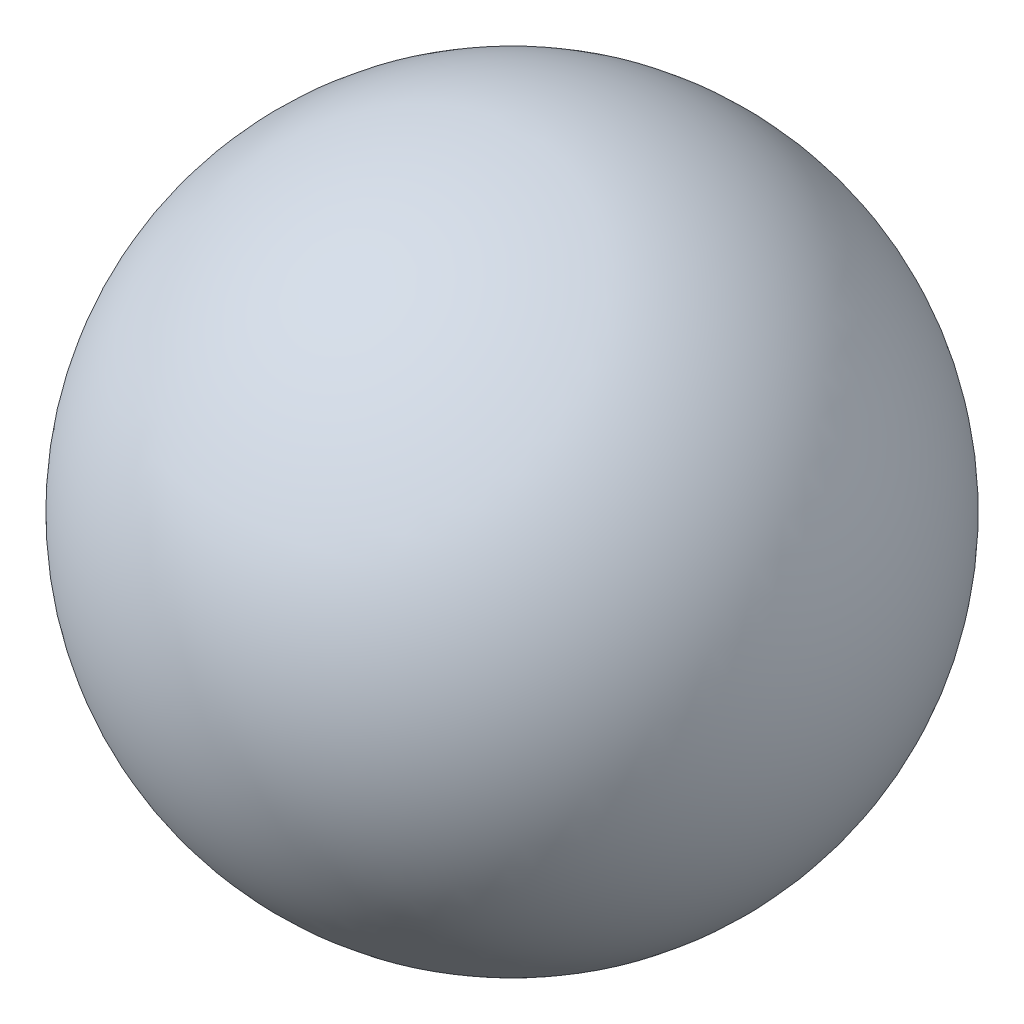
ISO-10303-21;
HEADER;
FILE_DESCRIPTION(('STEP AP214'),'2;1');
FILE_NAME('part.step','',(''),(''),'','','');
FILE_SCHEMA(('AUTOMOTIVE_DESIGN { 1 0 10303 214 1 1 1 1 }'));
ENDSEC;
DATA;
#1=APPLICATION_CONTEXT('core data for automotive mechanical design processes');
#2=APPLICATION_PROTOCOL_DEFINITION('international standard','automotive_design',2000,#1);
#3=PRODUCT_CONTEXT('',#1,'mechanical');
#4=PRODUCT('Part','Part','',(#3));
#5=PRODUCT_RELATED_PRODUCT_CATEGORY('part','',(#4));
#6=PRODUCT_DEFINITION_FORMATION('','',#4);
#7=PRODUCT_DEFINITION_CONTEXT('part definition',#1,'design');
#8=PRODUCT_DEFINITION('design','',#6,#7);
#9=PRODUCT_DEFINITION_SHAPE('','',#8);
#10=(LENGTH_UNIT() NAMED_UNIT(*) SI_UNIT(.MILLI.,.METRE.));
#11=(NAMED_UNIT(*) PLANE_ANGLE_UNIT() SI_UNIT($,.RADIAN.));
#12=(NAMED_UNIT(*) SI_UNIT($,.STERADIAN.) SOLID_ANGLE_UNIT());
#13=UNCERTAINTY_MEASURE_WITH_UNIT(LENGTH_MEASURE(1.E-05),#10,'distance_accuracy_value','');
#14=(GEOMETRIC_REPRESENTATION_CONTEXT(3) GLOBAL_UNCERTAINTY_ASSIGNED_CONTEXT((#13)) GLOBAL_UNIT_ASSIGNED_CONTEXT((#10,
#11,#12)) REPRESENTATION_CONTEXT('',''));
#15=CARTESIAN_POINT('',(0.,0.,0.));
#16=DIRECTION('',(0.,0.,1.));
#17=DIRECTION('',(1.,0.,0.));
#18=AXIS2_PLACEMENT_3D('',#15,#16,#17);
#19=CARTESIAN_POINT('',(-8.04836873207004,28.1692905622452,0.));
#20=DIRECTION('',(0.,1.,0.));
#21=DIRECTION('',(1.,0.,0.));
#22=AXIS2_PLACEMENT_3D('',#19,#20,#21);
#23=SPHERICAL_SURFACE('',#22,25.598842603179);
#24=CARTESIAN_POINT('',(-8.04836873207004,53.7681331654242,0.));
#25=VERTEX_POINT('',#24);
#26=VERTEX_LOOP('',#25);
#27=FACE_BOUND('',#26,.T.);
#28=ADVANCED_FACE('F41',(#27),#23,.T.);
#29=CLOSED_SHELL('',(#28));
#30=MANIFOLD_SOLID_BREP('B2',#29);
#31=ADVANCED_BREP_SHAPE_REPRESENTATION('',(#18,#30),#14);
#32=SHAPE_DEFINITION_REPRESENTATION(#9,#31);
ENDSEC;
END-ISO-10303-21;
